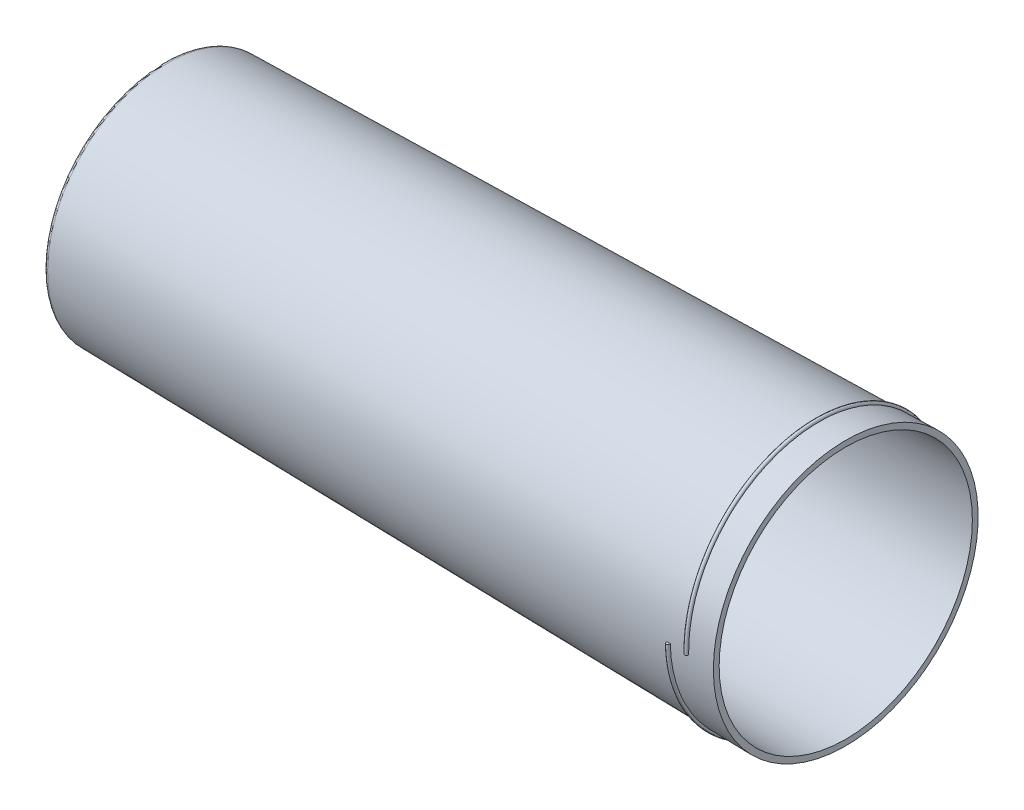
ISO-10303-21;
HEADER;
FILE_DESCRIPTION(('STEP AP214'),'2;1');
FILE_NAME('part.step','',(''),(''),'','','');
FILE_SCHEMA(('AUTOMOTIVE_DESIGN { 1 0 10303 214 1 1 1 1 }'));
ENDSEC;
DATA;
#1=APPLICATION_CONTEXT('core data for automotive mechanical design processes');
#2=APPLICATION_PROTOCOL_DEFINITION('international standard','automotive_design',2000,#1);
#3=PRODUCT_CONTEXT('',#1,'mechanical');
#4=PRODUCT('Part','Part','',(#3));
#5=PRODUCT_RELATED_PRODUCT_CATEGORY('part','',(#4));
#6=PRODUCT_DEFINITION_FORMATION('','',#4);
#7=PRODUCT_DEFINITION_CONTEXT('part definition',#1,'design');
#8=PRODUCT_DEFINITION('design','',#6,#7);
#9=PRODUCT_DEFINITION_SHAPE('','',#8);
#10=(LENGTH_UNIT() NAMED_UNIT(*) SI_UNIT(.MILLI.,.METRE.));
#11=(NAMED_UNIT(*) PLANE_ANGLE_UNIT() SI_UNIT($,.RADIAN.));
#12=(NAMED_UNIT(*) SI_UNIT($,.STERADIAN.) SOLID_ANGLE_UNIT());
#13=UNCERTAINTY_MEASURE_WITH_UNIT(LENGTH_MEASURE(1.E-05),#10,'distance_accuracy_value','');
#14=(GEOMETRIC_REPRESENTATION_CONTEXT(3) GLOBAL_UNCERTAINTY_ASSIGNED_CONTEXT((#13)) GLOBAL_UNIT_ASSIGNED_CONTEXT((#10,
#11,#12)) REPRESENTATION_CONTEXT('',''));
#15=CARTESIAN_POINT('',(0.,0.,0.));
#16=DIRECTION('',(0.,0.,1.));
#17=DIRECTION('',(1.,0.,0.));
#18=AXIS2_PLACEMENT_3D('',#15,#16,#17);
#19=CARTESIAN_POINT('',(-33.9169217381076,-3.35827861706436,0.488377080177612));
#20=DIRECTION('',(0.,-1.,0.));
#21=DIRECTION('',(0.,0.,1.));
#22=AXIS2_PLACEMENT_3D('',#19,#20,#21);
#23=CIRCLE('',#22,19.5655128776019);
#24=TRIMMED_CURVE('',#23,(PARAMETER_VALUE(-1.59576003778738)),
(PARAMETER_VALUE(1.59576003778738)),.T.,.PARAMETER.);
#25=CARTESIAN_POINT('',(-33.9169217381076,-3.35827861706436,0.));
#26=DIRECTION('',(-1.,0.,0.));
#27=AXIS1_PLACEMENT('',#25,#26);
#28=SURFACE_OF_REVOLUTION('',#24,#27);
#29=CARTESIAN_POINT('',(-14.4872844336335,-3.35827861706436,0.));
#30=DIRECTION('',(-1.,0.,0.));
#31=DIRECTION('',(0.,0.,1.));
#32=AXIS2_PLACEMENT_3D('',#29,#30,#31);
#33=CIRCLE('',#32,2.79022164056692);
#34=CARTESIAN_POINT('',(-14.4872844336335,-3.35827861706436,2.79022164056692));
#35=VERTEX_POINT('',#34);
#36=EDGE_CURVE('E42',#35,#35,#33,.T.);
#37=ORIENTED_EDGE('',*,*,#36,.T.);
#38=EDGE_LOOP('',(#37));
#39=FACE_BOUND('',#38,.T.);
#40=CARTESIAN_POINT('',(-14.3575050292392,-3.35827861706436,0.));
#41=VERTEX_POINT('',#40);
#42=VERTEX_LOOP('',#41);
#43=FACE_BOUND('',#42,.T.);
#44=ADVANCED_FACE('F34',(#39,#43),#28,.F.);
#45=CARTESIAN_POINT('',(1.99940089238273,-3.35827861706436,0.));
#46=DIRECTION('',(1.,0.,0.));
#47=DIRECTION('',(0.,0.,-1.));
#48=AXIS2_PLACEMENT_3D('',#45,#46,#47);
#49=CONICAL_SURFACE('',#48,3.19995533358639,0.0181798150729783);
#50=CARTESIAN_POINT('',(-14.3897967796635,-3.35827861706436,0.));
#51=DIRECTION('',(-1.,0.,0.));
#52=DIRECTION('',(0.,0.,1.));
#53=AXIS2_PLACEMENT_3D('',#50,#51,#52);
#54=CIRCLE('',#53,2.90196992136736);
#55=CARTESIAN_POINT('',(-14.3897967796635,-3.35827861706436,2.90196992136736));
#56=VERTEX_POINT('',#55);
#57=EDGE_CURVE('E11',#56,#56,#54,.F.);
#58=ORIENTED_EDGE('',*,*,#57,.T.);
#59=EDGE_LOOP('',(#58));
#60=FACE_BOUND('',#59,.T.);
#61=CARTESIAN_POINT('',(1.39289854396313,-3.35824998446583,3.18892801803204));
#62=CARTESIAN_POINT('',(1.37852376680591,-3.35824930830763,3.18866665844084));
#63=CARTESIAN_POINT('',(1.3641489896487,-3.35824863214944,3.18840529884965));
#64=CARTESIAN_POINT('',(1.33539943533428,-3.35824727983305,3.18788257966727));
#65=CARTESIAN_POINT('',(1.32102465817707,-3.35824660367486,3.18762122007608));
#66=CARTESIAN_POINT('',(1.30664988101986,-3.35824592751667,3.18735986048489));
#67=B_SPLINE_CURVE_WITH_KNOTS('',3,(#61,#62,#63,#64,#65,#66),.UNSPECIFIED.,.F.,.F.,(4,2,4),(0.,
0.0431314589193707,0.0862629178387413),.UNSPECIFIED.);
#68=CARTESIAN_POINT('',(1.39130472476389,-3.35824990949604,3.18889903950046));
#69=VERTEX_POINT('',#68);
#70=CARTESIAN_POINT('',(1.30866555298998,-3.35824602232948,3.18739650906713));
#71=VERTEX_POINT('',#70);
#72=EDGE_CURVE('E72',#69,#71,#67,.T.);
#73=ORIENTED_EDGE('',*,*,#72,.T.);
#74=CARTESIAN_POINT('',(1.30866555298998,-3.35824602232948,3.18739650906713));
#75=CARTESIAN_POINT('',(1.30808600616697,-3.32965008290397,3.18738626056073));
#76=CARTESIAN_POINT('',(1.30750188923466,-3.30105140471685,3.18699021635388));
#77=CARTESIAN_POINT('',(1.30573513408161,-3.21521264349062,3.18464518006102));
#78=CARTESIAN_POINT('',(1.30453949659667,-3.15800025770887,3.1815374149001));
#79=CARTESIAN_POINT('',(1.30211641070388,-3.04378407891343,3.17224258764961));
#80=CARTESIAN_POINT('',(1.30088893173842,-2.98678055107192,3.16605245539499));
#81=CARTESIAN_POINT('',(1.2957697064681,-2.75254259815176,3.1341820545032));
#82=CARTESIAN_POINT('',(1.29175314177442,-2.57693314291391,3.09502132521898));
#83=CARTESIAN_POINT('',(1.28356478226704,-2.23479180114021,2.9877298175326));
#84=CARTESIAN_POINT('',(1.27939294563238,-2.06826239043421,2.9195911819337));
#85=CARTESIAN_POINT('',(1.27314213048018,-1.83009130528964,2.79782933641681));
#86=CARTESIAN_POINT('',(1.27107394268554,-1.75313057972044,2.75434909009163));
#87=CARTESIAN_POINT('',(1.26694272976325,-1.6030877766989,2.66115871656707));
#88=CARTESIAN_POINT('',(1.26487970422612,-1.53000538166817,2.6114491005857));
#89=CARTESIAN_POINT('',(1.25866458831069,-1.31531822429877,2.45194799478854));
#90=CARTESIAN_POINT('',(1.2545434446799,-1.18044147280885,2.33289205120968));
#91=CARTESIAN_POINT('',(1.24647655696278,-0.932610290757847,2.07378081277635));
#92=CARTESIAN_POINT('',(1.2425308314522,-0.819658177643247,1.93372330081475));
#93=CARTESIAN_POINT('',(1.23693758106423,-0.669839469490854,1.71210684868221));
#94=CARTESIAN_POINT('',(1.23513853218174,-0.623418626663763,1.63686226805306));
#95=CARTESIAN_POINT('',(1.23150560321818,-0.536997528760814,1.48281063186174));
#96=CARTESIAN_POINT('',(1.22967173598148,-0.496994955562684,1.40400487574906));
#97=CARTESIAN_POINT('',(1.2240005657109,-0.386084517808985,1.160899472469));
#98=CARTESIAN_POINT('',(1.22003592538483,-0.325511230872293,0.991741259022659));
#99=CARTESIAN_POINT('',(1.21192853265317,-0.233547796678836,0.645403672414726));
#100=CARTESIAN_POINT('',(1.20778544474167,-0.202215377367323,0.468209153534356));
#101=CARTESIAN_POINT('',(1.19943275175159,-0.169761175836146,0.111092317628086));
#102=CARTESIAN_POINT('',(1.19522315224865,-0.168636874593551,-0.0688297706967448));
#103=CARTESIAN_POINT('',(1.18686511980561,-0.196657707950437,-0.426079812812982));
#104=CARTESIAN_POINT('',(1.18271659344367,-0.225750348153265,-0.603411724540245));
#105=CARTESIAN_POINT('',(1.17665427586063,-0.29102512822327,-0.862551376380789));
#106=CARTESIAN_POINT('',(1.1746720833377,-0.316167449579507,-0.947282334247985));
#107=CARTESIAN_POINT('',(1.17076357808578,-0.373389897172494,-1.11433222305665));
#108=CARTESIAN_POINT('',(1.16883722922219,-0.405465418140024,-1.19665271409687));
#109=CARTESIAN_POINT('',(1.16505562861777,-0.476341315494451,-1.35834144971153));
#110=CARTESIAN_POINT('',(1.16320037737263,-0.515141738755384,-1.43770967370334));
#111=CARTESIAN_POINT('',(1.15956363663758,-0.599206087808835,-1.59296363027728));
#112=CARTESIAN_POINT('',(1.15778215717563,-0.644470888621587,-1.66884888956368));
#113=CARTESIAN_POINT('',(1.15411375323251,-0.74113148295784,-1.81656844403496));
#114=CARTESIAN_POINT('',(1.15222686496822,-0.792525177489173,-1.88840411376072));
#115=CARTESIAN_POINT('',(1.14839632985809,-0.901100298407268,-2.02755802476442));
#116=CARTESIAN_POINT('',(1.14645268304269,-0.958281721690246,-2.09487626846489));
#117=CARTESIAN_POINT('',(1.14251192452209,-1.07805025576809,-2.22454433699382));
#118=CARTESIAN_POINT('',(1.14051480124646,-1.14063854304775,-2.28689307479959));
#119=CARTESIAN_POINT('',(1.13648477616659,-1.27074906964989,-2.40614926203791));
#120=CARTESIAN_POINT('',(1.1344518903819,-1.33826914049142,-2.46305907782952));
#121=CARTESIAN_POINT('',(1.13036946227746,-1.47757464661473,-2.57090022629461));
#122=CARTESIAN_POINT('',(1.12831999530376,-1.54934554725361,-2.62185033906925));
#123=CARTESIAN_POINT('',(1.1242050078097,-1.69711495408071,-2.717802537216));
#124=CARTESIAN_POINT('',(1.12213945623885,-1.77312731154542,-2.76278329225264));
#125=CARTESIAN_POINT('',(1.11801363440483,-1.92862338185563,-2.84627551440945));
#126=CARTESIAN_POINT('',(1.11595336402189,-2.00810701523364,-2.88478712952913));
#127=CARTESIAN_POINT('',(1.11185946942839,-2.16971958631693,-2.95495503681968));
#128=CARTESIAN_POINT('',(1.10982577784384,-2.25183846012747,-2.98663450401517));
#129=CARTESIAN_POINT('',(1.10578447792255,-2.4187023445407,-3.04318581454691));
#130=CARTESIAN_POINT('',(1.10377698339243,-2.50345541803016,-3.06803386225899));
#131=CARTESIAN_POINT('',(1.09981031046761,-2.67474506721548,-3.11060602905567));
#132=CARTESIAN_POINT('',(1.0978511350527,-2.7612817523033,-3.12832970981561));
#133=CARTESIAN_POINT('',(1.09399661476412,-2.93520156152902,-3.15648242005434));
#134=CARTESIAN_POINT('',(1.0921010710005,-3.02258067802253,-3.16693668974847));
#135=CARTESIAN_POINT('',(1.08653743945081,-3.28611628103293,-3.18741267100496));
#136=CARTESIAN_POINT('',(1.08300196191106,-3.46326150771227,-3.18644616283997));
#137=CARTESIAN_POINT('',(1.07551376437265,-3.81722802205517,-3.15497990755656));
#138=CARTESIAN_POINT('',(1.0715560539918,-3.99401262087219,-3.12408145905558));
#139=CARTESIAN_POINT('',(1.06346924855679,-4.34019563597277,-3.0329847636094));
#140=CARTESIAN_POINT('',(1.05933988704164,-4.50958166261144,-2.97273927857117));
#141=CARTESIAN_POINT('',(1.05100616131847,-4.83582865366921,-2.82464616180363));
#142=CARTESIAN_POINT('',(1.04680178240374,-4.99268712838574,-2.73679306042256));
#143=CARTESIAN_POINT('',(1.03845106514668,-5.2891817258791,-2.5360896021149));
#144=CARTESIAN_POINT('',(1.0343046299495,-5.42885070142643,-2.42328811894777));
#145=CARTESIAN_POINT('',(1.02824198648221,-5.62169171328834,-2.23870456566388));
#146=CARTESIAN_POINT('',(1.02625951188845,-5.68285440181644,-2.17506992554748));
#147=CARTESIAN_POINT('',(1.02234793018393,-5.79972485718157,-2.04290243073791));
#148=CARTESIAN_POINT('',(1.02041884219876,-5.85543068681215,-1.97436785137567));
#149=CARTESIAN_POINT('',(1.01660160230523,-5.96168688365675,-1.83192444410202));
#150=CARTESIAN_POINT('',(1.0147143944459,-6.01215466270256,-1.75795407073536));
#151=CARTESIAN_POINT('',(1.01102454794115,-6.10670287168693,-1.60598942220147));
#152=CARTESIAN_POINT('',(1.00922194673623,-6.15078049151444,-1.52799339705078));
#153=CARTESIAN_POINT('',(1.00551122075601,-6.23218908983905,-1.36858882312754));
#154=CARTESIAN_POINT('',(1.00360312819382,-6.26952211318443,-1.28718131791103));
#155=CARTESIAN_POINT('',(0.999727098431439,-6.33719456666231,-1.12151135931561));
#156=CARTESIAN_POINT('',(0.997759160715548,-6.36753393650958,-1.03724888133405));
#157=CARTESIAN_POINT('',(0.993797284552738,-6.42061747034618,-0.867692116437556));
#158=CARTESIAN_POINT('',(0.991804127976883,-6.44346466444298,-0.782430134678253));
#159=CARTESIAN_POINT('',(0.987781389274156,-6.48199824396164,-0.610327771681435));
#160=CARTESIAN_POINT('',(0.985751807951428,-6.49768478726668,-0.523487425288744));
#161=CARTESIAN_POINT('',(0.979569828247021,-6.53416118558745,-0.25898615008721));
#162=CARTESIAN_POINT('',(0.975377772394864,-6.54364951025505,-0.0796376997945706));
#163=CARTESIAN_POINT('',(0.967015496827846,-6.53233175133398,0.278144321731111));
#164=CARTESIAN_POINT('',(0.962845282549277,-6.51151845480309,0.456577664986818));
#165=CARTESIAN_POINT('',(0.956726718562413,-6.45837050616099,0.718324361065296));
#166=CARTESIAN_POINT('',(0.954722902496804,-6.43721208106498,0.804037223398756));
#167=CARTESIAN_POINT('',(0.950766774105431,-6.3878675450378,0.973347182095322));
#168=CARTESIAN_POINT('',(0.948814412548822,-6.35968844290753,1.05694629749616));
#169=CARTESIAN_POINT('',(0.944962927952914,-6.2964797537005,1.22152978090287));
#170=CARTESIAN_POINT('',(0.943063816642343,-6.26144867077133,1.302513573453));
#171=CARTESIAN_POINT('',(0.939369008344912,-6.18477361032136,1.46131452604996));
#172=CARTESIAN_POINT('',(0.937573336618529,-6.14312802675646,1.53913091124987));
#173=CARTESIAN_POINT('',(0.933954133016212,-6.05353286888042,1.69100043871083));
#174=CARTESIAN_POINT('',(0.932130615052637,-6.00558635704223,1.76505538507427));
#175=CARTESIAN_POINT('',(0.928398079022816,-5.90373015339216,1.90890591043833));
#176=CARTESIAN_POINT('',(0.926489068016852,-5.84982095345918,1.97870184004126));
#177=CARTESIAN_POINT('',(0.920678864532053,-5.67967881884201,2.1809773342431));
#178=CARTESIAN_POINT('',(0.916691500547232,-5.55495658931905,2.30647104305882));
#179=CARTESIAN_POINT('',(0.908589671386445,-5.28643835441395,2.53504748625633));
#180=CARTESIAN_POINT('',(0.904475206259286,-5.14264235635607,2.63813022924384));
#181=CARTESIAN_POINT('',(0.898307343804239,-4.91606195718416,2.77363346375753));
#182=CARTESIAN_POINT('',(0.896254702534147,-4.83882851130012,2.815572117088));
#183=CARTESIAN_POINT('',(0.892153121851461,-4.68086090578643,2.89306256347917));
#184=CARTESIAN_POINT('',(0.890104220801227,-4.60011539709991,2.92859139243951));
#185=CARTESIAN_POINT('',(0.88603242364764,-4.43596295057418,2.99281417654348));
#186=CARTESIAN_POINT('',(0.88400952529441,-4.35255624519869,3.0215087268389));
#187=CARTESIAN_POINT('',(0.880010268498427,-4.18393790354529,3.07178675266821));
#188=CARTESIAN_POINT('',(0.878033774706795,-4.09873340429156,3.09339417927029));
#189=CARTESIAN_POINT('',(0.873675166715258,-3.90661387512484,3.13372547115726));
#190=CARTESIAN_POINT('',(0.871306887924226,-3.79930244086756,3.15057832138753));
#191=CARTESIAN_POINT('',(0.866676244686251,-3.58352897926682,3.17322418462235));
#192=CARTESIAN_POINT('',(0.864413836005764,-3.4750674560997,3.17902185756614));
#193=CARTESIAN_POINT('',(0.862160512626194,-3.3638537610941,3.17927459923186));
#194=CARTESIAN_POINT('',(0.862103533205013,-3.36103936095797,3.17927725305137));
#195=CARTESIAN_POINT('',(0.862046598588409,-3.35822501434726,3.17927616415644));
#196=B_SPLINE_CURVE_WITH_KNOTS('',3,(#74,#75,#76,#77,#78,#79,#80,#81,#82,#83,#84,#85,#86,#87,
#88,#89,#90,#91,#92,#93,#94,#95,#96,#97,#98,#99,#100,#101,#102,#103,#104,#105,#106,#107,#108,
#109,#110,#111,#112,#113,#114,#115,#116,#117,#118,#119,#120,#121,#122,#123,#124,#125,#126,#127,
#128,#129,#130,#131,#132,#133,#134,#135,#136,#137,#138,#139,#140,#141,#142,#143,#144,#145,#146,
#147,#148,#149,#150,#151,#152,#153,#154,#155,#156,#157,#158,#159,#160,#161,#162,#163,#164,#165,
#166,#167,#168,#169,#170,#171,#172,#173,#174,#175,#176,#177,#178,#179,#180,#181,#182,#183,#184,
#185,#186,#187,#188,#189,#190,#191,#192,#193,#194,#195),.UNSPECIFIED.,.F.,.F.,(4,2,2,2,2,2,2,2,
2,2,2,2,2,2,2,2,2,2,2,2,2,2,2,2,2,2,2,2,2,2,2,2,2,2,2,2,2,2,2,2,2,2,2,2,2,2,2,2,2,2,2,2,2,2,2,2,
2,2,2,2,4),(0.,0.0858101993932279,0.257641700880067,0.429644697031222,0.966743547693971,
1.50398812264062,1.7689745899681,2.03393932520151,2.57108245879826,3.1082823378425,
3.37330534673778,3.63823241926734,4.17463090717442,4.71208613804596,5.24949655095666,
5.78597490642911,6.0509398770879,6.31572938681435,6.58052074225567,6.84534797397226,
7.11008476807994,7.37482142021801,7.63961582245688,7.90429448876256,8.16811525494664,
8.4328547106865,8.69758810895245,8.96140887823086,9.22613728543253,9.49088197748206,
9.75470279330755,10.2835949382938,10.8196303321366,11.3565314141209,11.8935389346815,
12.4295036340432,12.6941089551005,12.9588078742298,13.2271925947915,13.4956949834588,
13.7641158295985,14.0325389894369,14.2970988399045,14.5616528568839,15.0978802319536,
15.6342352704737,15.8989072278672,16.1633160123885,16.4277825844121,16.6923134690959,
16.9567162547139,17.2210972452469,17.749423927678,18.2777504072341,18.5412275122323,
18.8056305864535,19.0700106271473,19.3334877568519,19.6588841945597,19.9841434419657,
19.9925883647784),.UNSPECIFIED.);
#197=CARTESIAN_POINT('',(0.862046598588404,-3.35822501434688,3.17927616415643));
#198=VERTEX_POINT('',#197);
#199=EDGE_CURVE('E65',#71,#198,#196,.T.);
#200=ORIENTED_EDGE('',*,*,#199,.T.);
#201=CARTESIAN_POINT('',(0.942898543963126,-3.35822881744627,3.18074619958891));
#202=CARTESIAN_POINT('',(0.928523766805915,-3.35822814128806,3.18048483999318));
#203=CARTESIAN_POINT('',(0.914148989648703,-3.35822746512986,3.18022348039745));
#204=CARTESIAN_POINT('',(0.885399435334279,-3.35822611281345,3.17970076120599));
#205=CARTESIAN_POINT('',(0.871024658177067,-3.35822543665524,3.17943940161026));
#206=CARTESIAN_POINT('',(0.856649881019856,-3.35822476049704,3.17917804201452));
#207=B_SPLINE_CURVE_WITH_KNOTS('',3,(#201,#202,#203,#204,#205,#206),.UNSPECIFIED.,.F.,.F.,(4,2,
4),(0.,0.0431314589196184,0.0862629178392368),.UNSPECIFIED.);
#208=CARTESIAN_POINT('',(0.938221103525055,-3.35822859742966,3.18066115521385));
#209=VERTEX_POINT('',#208);
#210=EDGE_CURVE('E81',#209,#198,#207,.T.);
#211=ORIENTED_EDGE('',*,*,#210,.F.);
#212=CARTESIAN_POINT('',(0.938221103525055,-3.35822859742966,3.18066115521385));
#213=CARTESIAN_POINT('',(0.938810357354955,-3.38682389591315,3.18067281580369));
#214=CARTESIAN_POINT('',(0.939404258099886,-3.41542221344315,3.18029821629103));
#215=CARTESIAN_POINT('',(0.942399152759682,-3.55853270634396,3.17649230799657));
#216=CARTESIAN_POINT('',(0.944866676446429,-3.67293120402883,3.16725784405604));
#217=CARTESIAN_POINT('',(0.951272576526582,-3.96123616917384,3.128197532909));
#218=CARTESIAN_POINT('',(0.955288122903052,-4.1340492492115,3.08996693200514));
#219=CARTESIAN_POINT('',(0.963473595926934,-4.47098656444281,2.98538163229065));
#220=CARTESIAN_POINT('',(0.96764352250229,-4.63511080369176,2.91902694660634));
#221=CARTESIAN_POINT('',(0.973923325596061,-4.8712413745282,2.799908824569));
#222=CARTESIAN_POINT('',(0.976021888833425,-4.94831461368128,2.7569098314985));
#223=CARTESIAN_POINT('',(0.98021363869666,-5.09861080153351,2.66467013165815));
#224=CARTESIAN_POINT('',(0.982306827285226,-5.17183543294357,2.61543218538514));
#225=CARTESIAN_POINT('',(0.986466931575575,-5.31370785908714,2.51121649861242));
#226=CARTESIAN_POINT('',(0.988533910419202,-5.38236971123156,2.4562578677067));
#227=CARTESIAN_POINT('',(0.992641608088661,-5.5151449744919,2.34064186548358));
#228=CARTESIAN_POINT('',(0.994682207569313,-5.57924136434926,2.27996494678616));
#229=CARTESIAN_POINT('',(0.998715812353569,-5.70216917593171,2.15349811006986));
#230=CARTESIAN_POINT('',(1.00070882521246,-5.76100143756825,2.08770901085962));
#231=CARTESIAN_POINT('',(1.00364744389989,-5.8448873080291,1.98566907664551));
#232=CARTESIAN_POINT('',(1.00461688193636,-5.87207928933733,1.95115838482969));
#233=CARTESIAN_POINT('',(1.00654067330258,-5.92502250744336,1.88102858349727));
#234=CARTESIAN_POINT('',(1.00749501900769,-5.95077303171411,1.84540893911753));
#235=CARTESIAN_POINT('',(1.01226955369229,-6.07744803427593,1.66228356305087));
#236=CARTESIAN_POINT('',(1.015907080897,-6.16684307072956,1.50650635117675));
#237=CARTESIAN_POINT('',(1.02357110155081,-6.31821112518313,1.18209677723622));
#238=CARTESIAN_POINT('',(1.02759784001897,-6.38016673053222,1.0134563316846));
#239=CARTESIAN_POINT('',(1.03372402869997,-6.45086083705349,0.755902983190401));
#240=CARTESIAN_POINT('',(1.03576589180354,-6.47065632795472,0.669902389306554));
#241=CARTESIAN_POINT('',(1.03988284889132,-6.50304540207549,0.496570087827172));
#242=CARTESIAN_POINT('',(1.04195793806853,-6.51564001757833,0.409238572869912));
#243=CARTESIAN_POINT('',(1.04826856690837,-6.54271601185123,0.143611895539039));
#244=CARTESIAN_POINT('',(1.05253355759081,-6.54584349046439,-0.035963460571268));
#245=CARTESIAN_POINT('',(1.0610147474089,-6.52187064000097,-0.393098055835981));
#246=CARTESIAN_POINT('',(1.06523094440391,-6.49476898978892,-0.570657206531428));
#247=CARTESIAN_POINT('',(1.071396515525,-6.43242394909462,-0.830336312200582));
#248=CARTESIAN_POINT('',(1.07341244313363,-6.40825635148927,-0.915246496109869));
#249=CARTESIAN_POINT('',(1.07738938391933,-6.35294878698052,-1.08278834680222));
#250=CARTESIAN_POINT('',(1.07935039762515,-6.32180888723727,-1.1654200355241));
#251=CARTESIAN_POINT('',(1.08323368678918,-6.25227922074293,-1.32896825347821));
#252=CARTESIAN_POINT('',(1.08515500799616,-6.21379219654512,-1.40984338926001));
#253=CARTESIAN_POINT('',(1.08890610821629,-6.13012158437802,-1.56810129996978));
#254=CARTESIAN_POINT('',(1.09073584644696,-6.08493504794257,-1.64548251755818));
#255=CARTESIAN_POINT('',(1.09449971663023,-5.98821484264083,-1.79614478818961));
#256=CARTESIAN_POINT('',(1.09643382613795,-5.93668253539091,-1.86942671592945));
#257=CARTESIAN_POINT('',(1.10036416659008,-5.82762995662106,-2.01138857090005));
#258=CARTESIAN_POINT('',(1.1023603980505,-5.77010963535154,-2.08006845988838));
#259=CARTESIAN_POINT('',(1.10638006306017,-5.6503365271568,-2.21140636763545));
#260=CARTESIAN_POINT('',(1.108402714475,-5.58816203403193,-2.27413572431309));
#261=CARTESIAN_POINT('',(1.11248551591348,-5.45884127724734,-2.394201782095));
#262=CARTESIAN_POINT('',(1.11454566456252,-5.39169519556636,-2.45153868040918));
#263=CARTESIAN_POINT('',(1.12082170558855,-5.18147565868598,-2.61641814508));
#264=CARTESIAN_POINT('',(1.12507859458324,-5.03124731314022,-2.71504529633524));
#265=CARTESIAN_POINT('',(1.13357227524162,-4.71630975376729,-2.88566204048326));
#266=CARTESIAN_POINT('',(1.13780906180231,-4.5515970507829,-2.95764519319191));
#267=CARTESIAN_POINT('',(1.14402736670526,-4.29855270286293,-3.04370419749241));
#268=CARTESIAN_POINT('',(1.1460644525565,-4.21378142704125,-3.06864476926058));
#269=CARTESIAN_POINT('',(1.15008696750111,-4.04252334646574,-3.11138312703716));
#270=CARTESIAN_POINT('',(1.15207244597147,-3.9560383324023,-3.12918799472317));
#271=CARTESIAN_POINT('',(1.1559893102619,-3.78187091916876,-3.15755725025833));
#272=CARTESIAN_POINT('',(1.15792068256038,-3.69418822869147,-3.16811984341498));
#273=CARTESIAN_POINT('',(1.16168109253116,-3.51822491302878,-3.18192940204023));
#274=CARTESIAN_POINT('',(1.16351010515839,-3.4299441473803,-3.18517458467168));
#275=CARTESIAN_POINT('',(1.16718544832119,-3.25342103291744,-3.18432039542712));
#276=CARTESIAN_POINT('',(1.16903177736346,-3.16517868146478,-3.18022165117176));
#277=CARTESIAN_POINT('',(1.17281497646031,-2.98936789140532,-3.16472081692485));
#278=CARTESIAN_POINT('',(1.17475183927934,-2.90179939959219,-3.15331930965583));
#279=CARTESIAN_POINT('',(1.18064671842696,-2.64099931947442,-3.10825401749962));
#280=CARTESIAN_POINT('',(1.18469207270923,-2.46952593625227,-3.06372860223472));
#281=CARTESIAN_POINT('',(1.1929149841109,-2.13631913823124,-2.94687275005036));
#282=CARTESIAN_POINT('',(1.19709254117744,-1.97458571953898,-2.87454232424552));
#283=CARTESIAN_POINT('',(1.20335535589645,-1.74304922593251,-2.74701715757282));
#284=CARTESIAN_POINT('',(1.20543966114638,-1.66780518187577,-2.70140892260485));
#285=CARTESIAN_POINT('',(1.21169062514564,-1.4476321111322,-2.55513615271668));
#286=CARTESIAN_POINT('',(1.21584441916192,-1.30868466959964,-2.44521295948085));
#287=CARTESIAN_POINT('',(1.22398834979811,-1.0509338101429,-2.20386599533678));
#288=CARTESIAN_POINT('',(1.22797848635549,-0.932130399915298,-2.07244221621367));
#289=CARTESIAN_POINT('',(1.233762984139,-0.77170692972072,-1.86231763696018));
#290=CARTESIAN_POINT('',(1.23565536371702,-0.721250255563642,-1.79021363962446));
#291=CARTESIAN_POINT('',(1.23934661881068,-0.626326270885222,-1.641847761931));
#292=CARTESIAN_POINT('',(1.24114521809916,-0.581876100829429,-1.56557481996101));
#293=CARTESIAN_POINT('',(1.24483529741144,-0.49940827791993,-1.40952907101208));
#294=CARTESIAN_POINT('',(1.24672689837988,-0.461399303179805,-1.3297517218716));
#295=CARTESIAN_POINT('',(1.25255403245105,-0.356575039130582,-1.08385627797078));
#296=CARTESIAN_POINT('',(1.25659522768352,-0.300220138102162,-0.91313940629419));
#297=CARTESIAN_POINT('',(1.26484420614862,-0.217006495589204,-0.564717306105422));
#298=CARTESIAN_POINT('',(1.26905194736099,-0.190140362492042,-0.387013840416136));
#299=CARTESIAN_POINT('',(1.27536576820738,-0.172529837416544,-0.120297199012383));
#300=CARTESIAN_POINT('',(1.27745773739286,-0.170385639202849,-0.0319144337621124));
#301=CARTESIAN_POINT('',(1.28163819270012,-0.173435289769004,0.144695635981659));
#302=CARTESIAN_POINT('',(1.28372667968974,-0.178626900267538,0.232922979674095));
#303=CARTESIAN_POINT('',(1.29001930648222,-0.205433738015118,0.498871999607777));
#304=CARTESIAN_POINT('',(1.29419658289897,-0.23843191209238,0.675581271237993));
#305=CARTESIAN_POINT('',(1.30238471621206,-0.333693016347978,1.02121808610873));
#306=CARTESIAN_POINT('',(1.30639522652709,-0.396013871885056,1.19012949658238));
#307=CARTESIAN_POINT('',(1.31404232561454,-0.548147651951462,1.51507916502635));
#308=CARTESIAN_POINT('',(1.31767893393663,-0.637959138140756,1.67111809595682));
#309=CARTESIAN_POINT('',(1.32531656652405,-0.842392326518191,1.96565037614975));
#310=CARTESIAN_POINT('',(1.3293168779089,-0.956966075580395,2.10417682856534));
#311=CARTESIAN_POINT('',(1.33541269339181,-1.14405804751744,2.29513877759908));
#312=CARTESIAN_POINT('',(1.33744756483247,-1.20851304009862,2.35566244568067));
#313=CARTESIAN_POINT('',(1.34155115349706,-1.3422222956747,2.47115953220651));
#314=CARTESIAN_POINT('',(1.34361987223176,-1.41147677334308,2.5261327021151));
#315=CARTESIAN_POINT('',(1.34990880795621,-1.62766984742635,2.68351894284477));
#316=CARTESIAN_POINT('',(1.35415974202395,-1.78143968612945,2.77676671690876));
#317=CARTESIAN_POINT('',(1.36262149362449,-2.10266909794618,2.93622539031113));
#318=CARTESIAN_POINT('',(1.36683223424953,-2.27015063136564,3.00239185861694));
#319=CARTESIAN_POINT('',(1.37446724658739,-2.58799801580815,3.09791605106634));
#320=CARTESIAN_POINT('',(1.37791485483015,-2.7371703859305,3.1313024935647));
#321=CARTESIAN_POINT('',(1.38461369516212,-3.03849951504292,3.17634228849351));
#322=CARTESIAN_POINT('',(1.38786541128649,-3.19064757435069,3.18805153030863));
#323=CARTESIAN_POINT('',(1.39109162153527,-3.34784435486985,3.18888238345134));
#324=CARTESIAN_POINT('',(1.39119825144241,-3.35304725938601,3.1888971039845));
#325=CARTESIAN_POINT('',(1.39130472476389,-3.35824990949604,3.18889903950047));
#326=B_SPLINE_CURVE_WITH_KNOTS('',3,(#212,#213,#214,#215,#216,#217,#218,#219,#220,#221,#222,
#223,#224,#225,#226,#227,#228,#229,#230,#231,#232,#233,#234,#235,#236,#237,#238,#239,#240,#241,
#242,#243,#244,#245,#246,#247,#248,#249,#250,#251,#252,#253,#254,#255,#256,#257,#258,#259,#260,
#261,#262,#263,#264,#265,#266,#267,#268,#269,#270,#271,#272,#273,#274,#275,#276,#277,#278,#279,
#280,#281,#282,#283,#284,#285,#286,#287,#288,#289,#290,#291,#292,#293,#294,#295,#296,#297,#298,
#299,#300,#301,#302,#303,#304,#305,#306,#307,#308,#309,#310,#311,#312,#313,#314,#315,#316,#317,
#318,#319,#320,#321,#322,#323,#324,#325),.UNSPECIFIED.,.F.,.F.,(4,2,2,2,2,2,2,2,2,2,2,2,2,2,2,2,
2,2,2,2,2,2,2,2,2,2,2,2,2,2,2,2,2,2,2,2,2,2,2,2,2,2,2,2,2,2,2,2,2,2,2,2,2,2,2,2,4),(0.,
0.0858102254799557,0.429521397253219,0.958131428099997,1.4867412122295,1.75133286343757,
2.01580784916809,2.27942612013367,2.54398070612946,2.80849300589502,2.94029815096167,
3.07216788355439,3.60826841104547,4.1447086541268,4.40926002559269,4.67377346271578,
5.21002710982006,5.74630419430073,6.01096773622428,6.27562872890665,6.54407238228743,
6.81263453078565,7.08113915380426,7.34964600778993,7.61436140536629,7.87906711815474,
8.41563244133637,8.95232737443263,9.21723611700487,9.48188130161218,9.74659204369508,
10.0113672737786,10.2761198769381,10.5408513568474,11.0698781130963,11.598904657875,
11.8627314708271,12.3917580082519,12.9207847478057,13.1846116252775,13.4491761523467,
13.7140943367816,14.2508429827338,14.7874570572876,15.0524901819042,15.317442457819,
15.8541164284033,16.3918550491016,16.9295655395316,17.4662439158869,17.731302601549,
17.9963731505337,18.5332831551038,19.0710705454746,19.5283117364549,19.9843723916652,
19.9999843717426),.UNSPECIFIED.);
#327=EDGE_CURVE('E80',#209,#69,#326,.T.);
#328=ORIENTED_EDGE('',*,*,#327,.T.);
#329=EDGE_LOOP('',(#73,#200,#211,#328));
#330=FACE_BOUND('',#329,.T.);
#331=CARTESIAN_POINT('',(1.99940089238273,-3.35827861706436,0.));
#332=DIRECTION('',(-1.,0.,0.));
#333=DIRECTION('',(0.,0.,1.));
#334=AXIS2_PLACEMENT_3D('',#331,#332,#333);
#335=CIRCLE('',#334,3.19995533358639);
#336=CARTESIAN_POINT('',(1.99940089238273,-3.35827861706436,3.19995533358639));
#337=VERTEX_POINT('',#336);
#338=EDGE_CURVE('E193',#337,#337,#335,.T.);
#339=ORIENTED_EDGE('',*,*,#338,.T.);
#340=EDGE_LOOP('',(#339));
#341=FACE_BOUND('',#340,.T.);
#342=ADVANCED_FACE('F78',(#60,#330,#341),#49,.T.);
#343=CARTESIAN_POINT('',(1.99940089238273,-0.158323283477972,0.));
#344=DIRECTION('',(-1.,0.,0.));
#345=DIRECTION('',(0.,0.,1.));
#346=AXIS2_PLACEMENT_3D('',#343,#344,#345);
#347=PLANE('',#346);
#348=ORIENTED_EDGE('',*,*,#338,.F.);
#349=EDGE_LOOP('',(#348));
#350=FACE_BOUND('',#349,.T.);
#351=CARTESIAN_POINT('',(1.99940089238273,-3.35827861706436,0.));
#352=DIRECTION('',(-1.,0.,0.));
#353=DIRECTION('',(0.,0.,1.));
#354=AXIS2_PLACEMENT_3D('',#351,#352,#353);
#355=CIRCLE('',#354,3.05995533358639);
#356=CARTESIAN_POINT('',(1.99940089238273,-3.35827861706436,3.05995533358639));
#357=VERTEX_POINT('',#356);
#358=EDGE_CURVE('E196',#357,#357,#355,.T.);
#359=ORIENTED_EDGE('',*,*,#358,.T.);
#360=EDGE_LOOP('',(#359));
#361=FACE_BOUND('',#360,.T.);
#362=ADVANCED_FACE('F116',(#350,#361),#347,.F.);
#363=CARTESIAN_POINT('',(-14.3605991076173,-3.35827861706436,0.));
#364=DIRECTION('',(1.,0.,0.));
#365=DIRECTION('',(0.,0.,-1.));
#366=AXIS2_PLACEMENT_3D('',#363,#364,#365);
#367=CONICAL_SURFACE('',#366,2.75995533358639,0.0183353533452492);
#368=ORIENTED_EDGE('',*,*,#358,.F.);
#369=EDGE_LOOP('',(#368));
#370=FACE_BOUND('',#369,.T.);
#371=CARTESIAN_POINT('',(-14.3605991076173,-3.35827861706436,0.));
#372=DIRECTION('',(-1.,0.,0.));
#373=DIRECTION('',(0.,0.,1.));
#374=AXIS2_PLACEMENT_3D('',#371,#372,#373);
#375=CIRCLE('',#374,2.75995533358639);
#376=CARTESIAN_POINT('',(-14.3605991076173,-3.35827861706436,2.75995533358639));
#377=VERTEX_POINT('',#376);
#378=EDGE_CURVE('E197',#377,#377,#375,.T.);
#379=ORIENTED_EDGE('',*,*,#378,.T.);
#380=EDGE_LOOP('',(#379));
#381=FACE_BOUND('',#380,.T.);
#382=ADVANCED_FACE('F113',(#370,#381),#367,.F.);
#383=CARTESIAN_POINT('',(-28.8829313667933,-3.35827861706436,0.549901692748176));
#384=DIRECTION('',(0.,-1.,0.));
#385=DIRECTION('',(0.,0.,1.));
#386=AXIS2_PLACEMENT_3D('',#383,#384,#385);
#387=CIRCLE('',#386,14.689536117294);
#388=TRIMMED_CURVE('',#387,(PARAMETER_VALUE(-1.60824000137451)),
(PARAMETER_VALUE(1.60824000137451)),.T.,.PARAMETER.);
#389=CARTESIAN_POINT('',(-28.8829313667933,-3.35827861706436,0.));
#390=DIRECTION('',(-1.,0.,0.));
#391=AXIS1_PLACEMENT('',#389,#390);
#392=SURFACE_OF_REVOLUTION('',#388,#391);
#393=ORIENTED_EDGE('',*,*,#378,.F.);
#394=EDGE_LOOP('',(#393));
#395=FACE_BOUND('',#394,.T.);
#396=CARTESIAN_POINT('',(-14.2036916225286,-3.35827861706435,0.));
#397=VERTEX_POINT('',#396);
#398=VERTEX_LOOP('',#397);
#399=FACE_BOUND('',#398,.T.);
#400=ADVANCED_FACE('F103',(#395,#399),#392,.T.);
#401=CARTESIAN_POINT('',(1.34977421249149,-3.35816692998945,3.15682445972322));
#402=DIRECTION('',(0.,-0.999996653525114,-0.00258707142807299));
#403=DIRECTION('',(0.,0.00258707142807299,-0.999996653525114));
#404=AXIS2_PLACEMENT_3D('',#401,#402,#403);
#405=PLANE('',#404);
#406=ORIENTED_EDGE('',*,*,#72,.F.);
#407=CARTESIAN_POINT('',(1.34977421249149,-3.35827797830097,3.19974864754966));
#408=DIRECTION('',(0.,0.999996653525113,0.00258707142806795));
#409=DIRECTION('',(0.,-0.00258707142806796,0.999996653525114));
#410=AXIS2_PLACEMENT_3D('',#407,#408,#409);
#411=CIRCLE('',#410,0.0429243314716355);
#412=EDGE_CURVE('E49',#71,#69,#411,.T.);
#413=ORIENTED_EDGE('',*,*,#412,.F.);
#414=EDGE_LOOP('',(#406,#413));
#415=FACE_BOUND('',#414,.T.);
#416=ADVANCED_FACE('F75',(#415),#405,.T.);
#417=CARTESIAN_POINT('',(0.899774212491491,-3.35816692998945,3.15682445972322));
#418=DIRECTION('',(0.,-0.999996653525114,-0.00258707142807299));
#419=DIRECTION('',(0.,0.00258707142807299,-0.999996653525114));
#420=AXIS2_PLACEMENT_3D('',#417,#418,#419);
#421=PLANE('',#420);
#422=CARTESIAN_POINT('',(0.899774212491491,-3.35827797830097,3.19974864754966));
#423=DIRECTION('',(0.,-0.999996653525114,-0.00258707142806795));
#424=DIRECTION('',(0.,0.00258707142806795,-0.999996653525114));
#425=AXIS2_PLACEMENT_3D('',#422,#423,#424);
#426=CIRCLE('',#425,0.0429243314716355);
#427=EDGE_CURVE('E68',#209,#198,#426,.T.);
#428=ORIENTED_EDGE('',*,*,#427,.F.);
#429=ORIENTED_EDGE('',*,*,#210,.T.);
#430=EDGE_LOOP('',(#428,#429));
#431=FACE_BOUND('',#430,.T.);
#432=ADVANCED_FACE('F102',(#431),#421,.F.);
#433=CARTESIAN_POINT('',(1.34977421249149,-3.35838902661249,3.2426728353761));
#434=CARTESIAN_POINT('',(1.31227421249149,-1.48623099221421,3.24273658035843));
#435=CARTESIAN_POINT('',(1.27477421249149,-0.550096770241006,1.62143203516155));
#436=CARTESIAN_POINT('',(1.23727421249149,0.386037451732196,0.000127489964662139));
#437=CARTESIAN_POINT('',(1.19977421249149,-0.549986360692881,-1.62124080021455));
#438=CARTESIAN_POINT('',(1.16227421249149,-1.48601017311796,-3.24260909039377));
#439=CARTESIAN_POINT('',(1.12477421249149,-3.35816820751624,-3.2426728353761));
#440=CARTESIAN_POINT('',(1.08727421249149,-5.23032624191451,-3.24273658035843));
#441=CARTESIAN_POINT('',(1.04977421249149,-6.16646046388771,-1.62143203516155));
#442=CARTESIAN_POINT('',(1.01227421249149,-7.10259468586092,-0.000127489964662598));
#443=CARTESIAN_POINT('',(0.974774212491491,-6.16657087343584,1.62124080021455));
#444=CARTESIAN_POINT('',(0.937274212491491,-5.23054706101076,3.24260909039377));
#445=CARTESIAN_POINT('',(0.899774212491491,-3.35838902661249,3.2426728353761));
#446=CARTESIAN_POINT('',(1.43562287543476,-3.35838902661249,3.2426728353761));
#447=CARTESIAN_POINT('',(1.39812287543476,-1.48623099221421,3.24273658035843));
#448=CARTESIAN_POINT('',(1.36062287543476,-0.550096770241005,1.62143203516155));
#449=CARTESIAN_POINT('',(1.32312287543476,0.386037451732196,0.000127489964662139));
#450=CARTESIAN_POINT('',(1.28562287543476,-0.54998636069288,-1.62124080021455));
#451=CARTESIAN_POINT('',(1.24812287543476,-1.48601017311796,-3.24260909039377));
#452=CARTESIAN_POINT('',(1.21062287543476,-3.35816820751624,-3.2426728353761));
#453=CARTESIAN_POINT('',(1.17312287543476,-5.23032624191451,-3.24273658035843));
#454=CARTESIAN_POINT('',(1.13562287543476,-6.16646046388772,-1.62143203516155));
#455=CARTESIAN_POINT('',(1.09812287543476,-7.10259468586092,-0.000127489964662598));
#456=CARTESIAN_POINT('',(1.06062287543476,-6.16657087343584,1.62124080021455));
#457=CARTESIAN_POINT('',(1.02312287543476,-5.23054706101077,3.24260909039377));
#458=CARTESIAN_POINT('',(0.985622875434762,-3.35838902661249,3.2426728353761));
#459=CARTESIAN_POINT('',(1.43562287543476,-3.35816692998945,3.15682445972322));
#460=CARTESIAN_POINT('',(1.39812287543476,-1.53557347838385,3.15675997716046));
#461=CARTESIAN_POINT('',(1.36062287543476,-0.624332596118507,1.57831550601746));
#462=CARTESIAN_POINT('',(1.32312287543476,0.286908286146835,-0.00012896512553299));
#463=CARTESIAN_POINT('',(1.28562287543476,-0.624444283193421,-1.57850895370576));
#464=CARTESIAN_POINT('',(1.24812287543476,-1.53579685253368,-3.15688894228599));
#465=CARTESIAN_POINT('',(1.21062287543476,-3.35839030413927,-3.15682445972322));
#466=CARTESIAN_POINT('',(1.17312287543476,-5.18098375574487,-3.15675997716046));
#467=CARTESIAN_POINT('',(1.13562287543476,-6.09222463801022,-1.57831550601746));
#468=CARTESIAN_POINT('',(1.09812287543476,-7.00346552027556,0.000128965125532544));
#469=CARTESIAN_POINT('',(1.06062287543476,-6.0921129509353,1.57850895370576));
#470=CARTESIAN_POINT('',(1.02312287543476,-5.18076038159505,3.15688894228599));
#471=CARTESIAN_POINT('',(0.985622875434762,-3.35816692998945,3.15682445972322));
#472=CARTESIAN_POINT('',(1.34977421249149,-3.35816692998945,3.15682445972322));
#473=CARTESIAN_POINT('',(1.31227421249149,-1.53557347838385,3.15675997716046));
#474=CARTESIAN_POINT('',(1.27477421249149,-0.624332596118507,1.57831550601746));
#475=CARTESIAN_POINT('',(1.23727421249149,0.286908286146835,-0.00012896512553299));
#476=CARTESIAN_POINT('',(1.19977421249149,-0.624444283193421,-1.57850895370576));
#477=CARTESIAN_POINT('',(1.16227421249149,-1.53579685253368,-3.15688894228599));
#478=CARTESIAN_POINT('',(1.12477421249149,-3.35839030413927,-3.15682445972322));
#479=CARTESIAN_POINT('',(1.08727421249149,-5.18098375574487,-3.15675997716046));
#480=CARTESIAN_POINT('',(1.04977421249149,-6.09222463801021,-1.57831550601746));
#481=CARTESIAN_POINT('',(1.01227421249149,-7.00346552027556,0.000128965125532543));
#482=CARTESIAN_POINT('',(0.974774212491491,-6.0921129509353,1.57850895370576));
#483=CARTESIAN_POINT('',(0.937274212491491,-5.18076038159505,3.15688894228599));
#484=CARTESIAN_POINT('',(0.899774212491491,-3.35816692998945,3.15682445972322));
#485=CARTESIAN_POINT('',(1.26392554954822,-3.35816692998945,3.15682445972322));
#486=CARTESIAN_POINT('',(1.22642554954822,-1.53557347838385,3.15675997716046));
#487=CARTESIAN_POINT('',(1.18892554954822,-0.624332596118507,1.57831550601746));
#488=CARTESIAN_POINT('',(1.15142554954822,0.286908286146835,-0.00012896512553299));
#489=CARTESIAN_POINT('',(1.11392554954822,-0.624444283193421,-1.57850895370576));
#490=CARTESIAN_POINT('',(1.07642554954822,-1.53579685253368,-3.15688894228599));
#491=CARTESIAN_POINT('',(1.03892554954822,-3.35839030413927,-3.15682445972322));
#492=CARTESIAN_POINT('',(1.00142554954822,-5.18098375574487,-3.15675997716046));
#493=CARTESIAN_POINT('',(0.96392554954822,-6.09222463801022,-1.57831550601746));
#494=CARTESIAN_POINT('',(0.92642554954822,-7.00346552027556,0.000128965125532544));
#495=CARTESIAN_POINT('',(0.88892554954822,-6.0921129509353,1.57850895370576));
#496=CARTESIAN_POINT('',(0.85142554954822,-5.18076038159505,3.15688894228599));
#497=CARTESIAN_POINT('',(0.81392554954822,-3.35816692998945,3.15682445972322));
#498=CARTESIAN_POINT('',(1.26392554954822,-3.35838902661249,3.2426728353761));
#499=CARTESIAN_POINT('',(1.22642554954822,-1.48623099221421,3.24273658035843));
#500=CARTESIAN_POINT('',(1.18892554954822,-0.550096770241005,1.62143203516155));
#501=CARTESIAN_POINT('',(1.15142554954822,0.386037451732196,0.000127489964662139));
#502=CARTESIAN_POINT('',(1.11392554954822,-0.54998636069288,-1.62124080021455));
#503=CARTESIAN_POINT('',(1.07642554954822,-1.48601017311796,-3.24260909039377));
#504=CARTESIAN_POINT('',(1.03892554954822,-3.35816820751624,-3.2426728353761));
#505=CARTESIAN_POINT('',(1.00142554954822,-5.23032624191451,-3.24273658035843));
#506=CARTESIAN_POINT('',(0.96392554954822,-6.16646046388772,-1.62143203516155));
#507=CARTESIAN_POINT('',(0.92642554954822,-7.10259468586092,-0.000127489964662598));
#508=CARTESIAN_POINT('',(0.88892554954822,-6.16657087343584,1.62124080021455));
#509=CARTESIAN_POINT('',(0.85142554954822,-5.23054706101077,3.24260909039377));
#510=CARTESIAN_POINT('',(0.81392554954822,-3.35838902661249,3.2426728353761));
#511=CARTESIAN_POINT('',(1.34977421249149,-3.35838902661249,3.2426728353761));
#512=CARTESIAN_POINT('',(1.31227421249149,-1.48623099221421,3.24273658035843));
#513=CARTESIAN_POINT('',(1.27477421249149,-0.550096770241006,1.62143203516155));
#514=CARTESIAN_POINT('',(1.23727421249149,0.386037451732196,0.000127489964662139));
#515=CARTESIAN_POINT('',(1.19977421249149,-0.549986360692881,-1.62124080021455));
#516=CARTESIAN_POINT('',(1.16227421249149,-1.48601017311796,-3.24260909039377));
#517=CARTESIAN_POINT('',(1.12477421249149,-3.35816820751624,-3.2426728353761));
#518=CARTESIAN_POINT('',(1.08727421249149,-5.23032624191451,-3.24273658035843));
#519=CARTESIAN_POINT('',(1.04977421249149,-6.16646046388771,-1.62143203516155));
#520=CARTESIAN_POINT('',(1.01227421249149,-7.10259468586092,-0.000127489964662598));
#521=CARTESIAN_POINT('',(0.974774212491491,-6.16657087343584,1.62124080021455));
#522=CARTESIAN_POINT('',(0.937274212491491,-5.23054706101076,3.24260909039377));
#523=CARTESIAN_POINT('',(0.899774212491491,-3.35838902661249,3.2426728353761));
#524=(BOUNDED_SURFACE() B_SPLINE_SURFACE(3,2,((#433,#434,#435,#436,#437,#438,#439,#440,#441,
#442,#443,#444,#445),(#446,#447,#448,#449,#450,#451,#452,#453,#454,#455,#456,#457,#458),(#459,
#460,#461,#462,#463,#464,#465,#466,#467,#468,#469,#470,#471),(#472,#473,#474,#475,#476,#477,
#478,#479,#480,#481,#482,#483,#484),(#485,#486,#487,#488,#489,#490,#491,#492,#493,#494,#495,
#496,#497),(#498,#499,#500,#501,#502,#503,#504,#505,#506,#507,#508,#509,#510),(#511,#512,#513,
#514,#515,#516,#517,#518,#519,#520,#521,#522,#523)),.UNSPECIFIED.,.T.,.F.,
.F.) B_SPLINE_SURFACE_WITH_KNOTS((4,3,4),(3,2,2,2,2,2,3),(0.,0.5,1.),(0.,0.166666666666667,
0.333333333333333,0.5,0.666666666666667,0.833333333333333,1.),
.UNSPECIFIED.) GEOMETRIC_REPRESENTATION_ITEM() RATIONAL_B_SPLINE_SURFACE(((1.,0.866025403784439,
1.,0.866025403784439,1.,0.866025403784439,1.,0.866025403784439,1.,0.866025403784439,1.,
0.866025403784439,1.),(0.333333333333333,0.288675134594813,0.333333333333333,0.288675134594813,
0.333333333333333,0.288675134594813,0.333333333333333,0.288675134594813,0.333333333333333,
0.288675134594813,0.333333333333333,0.288675134594813,0.333333333333333),(0.333333333333333,
0.288675134594813,0.333333333333333,0.288675134594813,0.333333333333333,0.288675134594813,
0.333333333333333,0.288675134594813,0.333333333333333,0.288675134594813,0.333333333333333,
0.288675134594813,0.333333333333333),(1.,0.866025403784439,1.,0.866025403784439,1.,
0.866025403784439,1.,0.866025403784439,1.,0.866025403784439,1.,0.866025403784439,1.),
(0.333333333333333,0.288675134594813,0.333333333333333,0.288675134594813,0.333333333333333,
0.288675134594813,0.333333333333333,0.288675134594813,0.333333333333333,0.288675134594813,
0.333333333333333,0.288675134594813,0.333333333333333),(0.333333333333333,0.288675134594813,
0.333333333333333,0.288675134594813,0.333333333333333,0.288675134594813,0.333333333333333,
0.288675134594813,0.333333333333333,0.288675134594813,0.333333333333333,0.288675134594813,
0.333333333333333),(1.,0.866025403784439,1.,0.866025403784439,1.,0.866025403784439,1.,
0.866025403784439,1.,0.866025403784439,1.,0.866025403784439,1.))) REPRESENTATION_ITEM('') SURFACE());
#525=ORIENTED_EDGE('',*,*,#199,.F.);
#526=ORIENTED_EDGE('',*,*,#412,.T.);
#527=ORIENTED_EDGE('',*,*,#327,.F.);
#528=ORIENTED_EDGE('',*,*,#427,.T.);
#529=EDGE_LOOP('',(#525,#526,#527,#528));
#530=FACE_BOUND('',#529,.T.);
#531=ADVANCED_FACE('F66',(#530),#524,.T.);
#532=CARTESIAN_POINT('',(-14.3879788982968,-3.35827861706436,0.));
#533=DIRECTION('',(1.,0.,0.));
#534=DIRECTION('',(0.,0.,-1.));
#535=AXIS2_PLACEMENT_3D('',#532,#533,#534);
#536=TOROIDAL_SURFACE('',#535,2.80198644619603,0.1);
#537=ORIENTED_EDGE('',*,*,#57,.F.);
#538=EDGE_LOOP('',(#537));
#539=FACE_BOUND('',#538,.T.);
#540=ORIENTED_EDGE('',*,*,#36,.F.);
#541=EDGE_LOOP('',(#540));
#542=FACE_BOUND('',#541,.T.);
#543=ADVANCED_FACE('F36',(#539,#542),#536,.T.);
#544=CLOSED_SHELL('',(#44,#342,#362,#382,#400,#416,#432,#531,#543));
#545=MANIFOLD_SOLID_BREP('B2',#544);
#546=ADVANCED_BREP_SHAPE_REPRESENTATION('',(#18,#545),#14);
#547=SHAPE_DEFINITION_REPRESENTATION(#9,#546);
ENDSEC;
END-ISO-10303-21;
